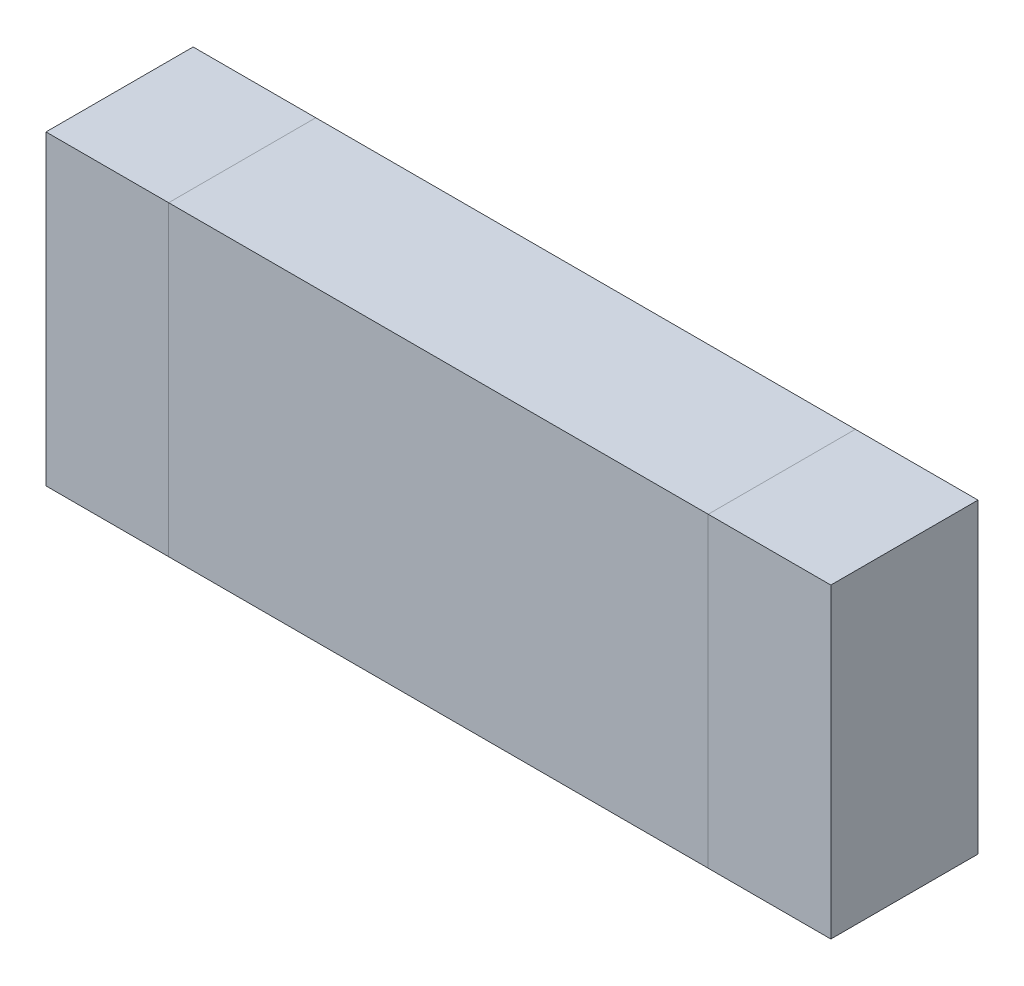
ISO-10303-21;
HEADER;
FILE_DESCRIPTION(('STEP AP214'),'2;1');
FILE_NAME('part.step','',(''),(''),'','','');
FILE_SCHEMA(('AUTOMOTIVE_DESIGN { 1 0 10303 214 1 1 1 1 }'));
ENDSEC;
DATA;
#1=APPLICATION_CONTEXT('core data for automotive mechanical design processes');
#2=APPLICATION_PROTOCOL_DEFINITION('international standard','automotive_design',2000,#1);
#3=PRODUCT_CONTEXT('',#1,'mechanical');
#4=PRODUCT('Part','Part','',(#3));
#5=PRODUCT_RELATED_PRODUCT_CATEGORY('part','',(#4));
#6=PRODUCT_DEFINITION_FORMATION('','',#4);
#7=PRODUCT_DEFINITION_CONTEXT('part definition',#1,'design');
#8=PRODUCT_DEFINITION('design','',#6,#7);
#9=PRODUCT_DEFINITION_SHAPE('','',#8);
#10=(LENGTH_UNIT() NAMED_UNIT(*) SI_UNIT(.MILLI.,.METRE.));
#11=(NAMED_UNIT(*) PLANE_ANGLE_UNIT() SI_UNIT($,.RADIAN.));
#12=(NAMED_UNIT(*) SI_UNIT($,.STERADIAN.) SOLID_ANGLE_UNIT());
#13=UNCERTAINTY_MEASURE_WITH_UNIT(LENGTH_MEASURE(1.E-05),#10,'distance_accuracy_value','');
#14=(GEOMETRIC_REPRESENTATION_CONTEXT(3) GLOBAL_UNCERTAINTY_ASSIGNED_CONTEXT((#13)) GLOBAL_UNIT_ASSIGNED_CONTEXT((#10,
#11,#12)) REPRESENTATION_CONTEXT('',''));
#15=CARTESIAN_POINT('',(0.,0.,0.));
#16=DIRECTION('',(0.,0.,1.));
#17=DIRECTION('',(1.,0.,0.));
#18=AXIS2_PLACEMENT_3D('',#15,#16,#17);
#19=CARTESIAN_POINT('',(-1.6,0.625,0.6));
#20=DIRECTION('',(0.,-1.,0.));
#21=DIRECTION('',(0.,0.,-1.));
#22=AXIS2_PLACEMENT_3D('',#19,#20,#21);
#23=PLANE('',#22);
#24=DIRECTION('',(0.,0.,1.));
#25=VECTOR('',#24,1.);
#26=CARTESIAN_POINT('',(-1.1,0.625,0.6));
#27=LINE('',#26,#25);
#28=CARTESIAN_POINT('',(-1.1,0.625,0.));
#29=VERTEX_POINT('',#28);
#30=CARTESIAN_POINT('',(-1.1,0.625,0.6));
#31=VERTEX_POINT('',#30);
#32=EDGE_CURVE('E11',#29,#31,#27,.T.);
#33=ORIENTED_EDGE('',*,*,#32,.F.);
#34=DIRECTION('',(-1.,0.,0.));
#35=VECTOR('',#34,1.);
#36=CARTESIAN_POINT('',(-1.6,0.625,0.));
#37=LINE('',#36,#35);
#38=CARTESIAN_POINT('',(-1.6,0.625,0.));
#39=VERTEX_POINT('',#38);
#40=EDGE_CURVE('E23',#29,#39,#37,.T.);
#41=ORIENTED_EDGE('',*,*,#40,.T.);
#42=DIRECTION('',(0.,0.,-1.));
#43=VECTOR('',#42,1.);
#44=CARTESIAN_POINT('',(-1.6,0.625,0.6));
#45=LINE('',#44,#43);
#46=CARTESIAN_POINT('',(-1.6,0.625,0.6));
#47=VERTEX_POINT('',#46);
#48=EDGE_CURVE('E150',#47,#39,#45,.T.);
#49=ORIENTED_EDGE('',*,*,#48,.F.);
#50=DIRECTION('',(-1.,0.,0.));
#51=VECTOR('',#50,1.);
#52=CARTESIAN_POINT('',(-1.6,0.625,0.6));
#53=LINE('',#52,#51);
#54=EDGE_CURVE('E147',#31,#47,#53,.T.);
#55=ORIENTED_EDGE('',*,*,#54,.F.);
#56=EDGE_LOOP('',(#33,#41,#49,#55));
#57=FACE_BOUND('',#56,.T.);
#58=ADVANCED_FACE('F16',(#57),#23,.F.);
#59=CARTESIAN_POINT('',(-1.6,0.625,0.6));
#60=DIRECTION('',(0.,-1.,0.));
#61=DIRECTION('',(0.,0.,-1.));
#62=AXIS2_PLACEMENT_3D('',#59,#60,#61);
#63=PLANE('',#62);
#64=DIRECTION('',(0.,0.,-1.));
#65=VECTOR('',#64,1.);
#66=CARTESIAN_POINT('',(1.1,0.625,0.6));
#67=LINE('',#66,#65);
#68=CARTESIAN_POINT('',(1.1,0.625,0.6));
#69=VERTEX_POINT('',#68);
#70=CARTESIAN_POINT('',(1.1,0.625,0.));
#71=VERTEX_POINT('',#70);
#72=EDGE_CURVE('E145',#69,#71,#67,.T.);
#73=ORIENTED_EDGE('',*,*,#72,.F.);
#74=DIRECTION('',(-1.,0.,0.));
#75=VECTOR('',#74,1.);
#76=CARTESIAN_POINT('',(-1.6,0.625,0.6));
#77=LINE('',#76,#75);
#78=CARTESIAN_POINT('',(1.6,0.625,0.6));
#79=VERTEX_POINT('',#78);
#80=EDGE_CURVE('E143',#79,#69,#77,.T.);
#81=ORIENTED_EDGE('',*,*,#80,.F.);
#82=DIRECTION('',(0.,0.,-1.));
#83=VECTOR('',#82,1.);
#84=CARTESIAN_POINT('',(1.6,0.625,0.6));
#85=LINE('',#84,#83);
#86=CARTESIAN_POINT('',(1.6,0.625,0.));
#87=VERTEX_POINT('',#86);
#88=EDGE_CURVE('E102',#79,#87,#85,.T.);
#89=ORIENTED_EDGE('',*,*,#88,.T.);
#90=DIRECTION('',(-1.,0.,0.));
#91=VECTOR('',#90,1.);
#92=CARTESIAN_POINT('',(-1.6,0.625,0.));
#93=LINE('',#92,#91);
#94=EDGE_CURVE('E139',#87,#71,#93,.T.);
#95=ORIENTED_EDGE('',*,*,#94,.T.);
#96=EDGE_LOOP('',(#73,#81,#89,#95));
#97=FACE_BOUND('',#96,.T.);
#98=ADVANCED_FACE('F182',(#97),#63,.F.);
#99=CARTESIAN_POINT('',(0.,0.,0.));
#100=DIRECTION('',(0.,0.,-1.));
#101=DIRECTION('',(-1.,0.,0.));
#102=AXIS2_PLACEMENT_3D('',#99,#100,#101);
#103=PLANE('',#102);
#104=ORIENTED_EDGE('',*,*,#40,.F.);
#105=DIRECTION('',(0.,-1.,0.));
#106=VECTOR('',#105,1.);
#107=CARTESIAN_POINT('',(-1.1,0.,0.));
#108=LINE('',#107,#106);
#109=CARTESIAN_POINT('',(-1.1,-0.625,0.));
#110=VERTEX_POINT('',#109);
#111=EDGE_CURVE('E137',#29,#110,#108,.T.);
#112=ORIENTED_EDGE('',*,*,#111,.T.);
#113=DIRECTION('',(1.,0.,0.));
#114=VECTOR('',#113,1.);
#115=CARTESIAN_POINT('',(1.6,-0.625,0.));
#116=LINE('',#115,#114);
#117=CARTESIAN_POINT('',(-1.6,-0.625,0.));
#118=VERTEX_POINT('',#117);
#119=EDGE_CURVE('E134',#118,#110,#116,.T.);
#120=ORIENTED_EDGE('',*,*,#119,.F.);
#121=DIRECTION('',(0.,-1.,0.));
#122=VECTOR('',#121,1.);
#123=CARTESIAN_POINT('',(-1.6,-0.625,0.));
#124=LINE('',#123,#122);
#125=EDGE_CURVE('E131',#39,#118,#124,.T.);
#126=ORIENTED_EDGE('',*,*,#125,.F.);
#127=EDGE_LOOP('',(#104,#112,#120,#126));
#128=FACE_BOUND('',#127,.T.);
#129=ADVANCED_FACE('F159',(#128),#103,.T.);
#130=CARTESIAN_POINT('',(0.,0.,0.));
#131=DIRECTION('',(0.,0.,-1.));
#132=DIRECTION('',(-1.,0.,0.));
#133=AXIS2_PLACEMENT_3D('',#130,#131,#132);
#134=PLANE('',#133);
#135=DIRECTION('',(1.,0.,0.));
#136=VECTOR('',#135,1.);
#137=CARTESIAN_POINT('',(1.6,-0.625,0.));
#138=LINE('',#137,#136);
#139=CARTESIAN_POINT('',(1.1,-0.625,0.));
#140=VERTEX_POINT('',#139);
#141=CARTESIAN_POINT('',(1.6,-0.625,0.));
#142=VERTEX_POINT('',#141);
#143=EDGE_CURVE('E83',#140,#142,#138,.T.);
#144=ORIENTED_EDGE('',*,*,#143,.F.);
#145=DIRECTION('',(0.,1.,0.));
#146=VECTOR('',#145,1.);
#147=CARTESIAN_POINT('',(1.1,0.,0.));
#148=LINE('',#147,#146);
#149=EDGE_CURVE('E127',#140,#71,#148,.T.);
#150=ORIENTED_EDGE('',*,*,#149,.T.);
#151=ORIENTED_EDGE('',*,*,#94,.F.);
#152=DIRECTION('',(0.,1.,0.));
#153=VECTOR('',#152,1.);
#154=CARTESIAN_POINT('',(1.6,0.625,0.));
#155=LINE('',#154,#153);
#156=EDGE_CURVE('E125',#142,#87,#155,.T.);
#157=ORIENTED_EDGE('',*,*,#156,.F.);
#158=EDGE_LOOP('',(#144,#150,#151,#157));
#159=FACE_BOUND('',#158,.T.);
#160=ADVANCED_FACE('F184',(#159),#134,.T.);
#161=CARTESIAN_POINT('',(1.6,-0.625,0.6));
#162=DIRECTION('',(0.,1.,0.));
#163=DIRECTION('',(0.,0.,1.));
#164=AXIS2_PLACEMENT_3D('',#161,#162,#163);
#165=PLANE('',#164);
#166=DIRECTION('',(0.,0.,-1.));
#167=VECTOR('',#166,1.);
#168=CARTESIAN_POINT('',(-1.1,-0.625,0.6));
#169=LINE('',#168,#167);
#170=CARTESIAN_POINT('',(-1.1,-0.625,0.6));
#171=VERTEX_POINT('',#170);
#172=EDGE_CURVE('E122',#171,#110,#169,.T.);
#173=ORIENTED_EDGE('',*,*,#172,.F.);
#174=DIRECTION('',(1.,0.,0.));
#175=VECTOR('',#174,1.);
#176=CARTESIAN_POINT('',(1.6,-0.625,0.6));
#177=LINE('',#176,#175);
#178=CARTESIAN_POINT('',(-1.6,-0.625,0.6));
#179=VERTEX_POINT('',#178);
#180=EDGE_CURVE('E119',#179,#171,#177,.T.);
#181=ORIENTED_EDGE('',*,*,#180,.F.);
#182=DIRECTION('',(0.,0.,-1.));
#183=VECTOR('',#182,1.);
#184=CARTESIAN_POINT('',(-1.6,-0.625,0.6));
#185=LINE('',#184,#183);
#186=EDGE_CURVE('E116',#179,#118,#185,.T.);
#187=ORIENTED_EDGE('',*,*,#186,.T.);
#188=ORIENTED_EDGE('',*,*,#119,.T.);
#189=EDGE_LOOP('',(#173,#181,#187,#188));
#190=FACE_BOUND('',#189,.T.);
#191=ADVANCED_FACE('F161',(#190),#165,.F.);
#192=CARTESIAN_POINT('',(1.6,-0.625,0.6));
#193=DIRECTION('',(0.,1.,0.));
#194=DIRECTION('',(0.,0.,1.));
#195=AXIS2_PLACEMENT_3D('',#192,#193,#194);
#196=PLANE('',#195);
#197=DIRECTION('',(0.,0.,1.));
#198=VECTOR('',#197,1.);
#199=CARTESIAN_POINT('',(1.1,-0.625,0.6));
#200=LINE('',#199,#198);
#201=CARTESIAN_POINT('',(1.1,-0.625,0.6));
#202=VERTEX_POINT('',#201);
#203=EDGE_CURVE('E88',#140,#202,#200,.T.);
#204=ORIENTED_EDGE('',*,*,#203,.F.);
#205=ORIENTED_EDGE('',*,*,#143,.T.);
#206=DIRECTION('',(0.,0.,-1.));
#207=VECTOR('',#206,1.);
#208=CARTESIAN_POINT('',(1.6,-0.625,0.6));
#209=LINE('',#208,#207);
#210=CARTESIAN_POINT('',(1.6,-0.625,0.6));
#211=VERTEX_POINT('',#210);
#212=EDGE_CURVE('E77',#211,#142,#209,.T.);
#213=ORIENTED_EDGE('',*,*,#212,.F.);
#214=DIRECTION('',(1.,0.,0.));
#215=VECTOR('',#214,1.);
#216=CARTESIAN_POINT('',(1.6,-0.625,0.6));
#217=LINE('',#216,#215);
#218=EDGE_CURVE('E81',#202,#211,#217,.T.);
#219=ORIENTED_EDGE('',*,*,#218,.F.);
#220=EDGE_LOOP('',(#204,#205,#213,#219));
#221=FACE_BOUND('',#220,.T.);
#222=ADVANCED_FACE('F80',(#221),#196,.F.);
#223=CARTESIAN_POINT('',(0.,0.,0.6));
#224=DIRECTION('',(0.,0.,-1.));
#225=DIRECTION('',(-1.,0.,0.));
#226=AXIS2_PLACEMENT_3D('',#223,#224,#225);
#227=PLANE('',#226);
#228=DIRECTION('',(0.,-1.,0.));
#229=VECTOR('',#228,1.);
#230=CARTESIAN_POINT('',(-1.1,0.,0.6));
#231=LINE('',#230,#229);
#232=EDGE_CURVE('E98',#31,#171,#231,.T.);
#233=ORIENTED_EDGE('',*,*,#232,.F.);
#234=ORIENTED_EDGE('',*,*,#54,.T.);
#235=DIRECTION('',(0.,-1.,0.));
#236=VECTOR('',#235,1.);
#237=CARTESIAN_POINT('',(-1.6,-0.625,0.6));
#238=LINE('',#237,#236);
#239=EDGE_CURVE('E105',#47,#179,#238,.T.);
#240=ORIENTED_EDGE('',*,*,#239,.T.);
#241=ORIENTED_EDGE('',*,*,#180,.T.);
#242=EDGE_LOOP('',(#233,#234,#240,#241));
#243=FACE_BOUND('',#242,.T.);
#244=ADVANCED_FACE('F228',(#243),#227,.F.);
#245=CARTESIAN_POINT('',(0.,0.,0.6));
#246=DIRECTION('',(0.,0.,-1.));
#247=DIRECTION('',(-1.,0.,0.));
#248=AXIS2_PLACEMENT_3D('',#245,#246,#247);
#249=PLANE('',#248);
#250=DIRECTION('',(0.,1.,0.));
#251=VECTOR('',#250,1.);
#252=CARTESIAN_POINT('',(1.1,0.,0.6));
#253=LINE('',#252,#251);
#254=EDGE_CURVE('E96',#202,#69,#253,.T.);
#255=ORIENTED_EDGE('',*,*,#254,.F.);
#256=ORIENTED_EDGE('',*,*,#218,.T.);
#257=DIRECTION('',(0.,1.,0.));
#258=VECTOR('',#257,1.);
#259=CARTESIAN_POINT('',(1.6,0.625,0.6));
#260=LINE('',#259,#258);
#261=EDGE_CURVE('E94',#211,#79,#260,.T.);
#262=ORIENTED_EDGE('',*,*,#261,.T.);
#263=ORIENTED_EDGE('',*,*,#80,.T.);
#264=EDGE_LOOP('',(#255,#256,#262,#263));
#265=FACE_BOUND('',#264,.T.);
#266=ADVANCED_FACE('F92',(#265),#249,.F.);
#267=CARTESIAN_POINT('',(1.6,0.625,0.6));
#268=DIRECTION('',(-1.,0.,0.));
#269=DIRECTION('',(0.,0.,1.));
#270=AXIS2_PLACEMENT_3D('',#267,#268,#269);
#271=PLANE('',#270);
#272=ORIENTED_EDGE('',*,*,#156,.T.);
#273=ORIENTED_EDGE('',*,*,#88,.F.);
#274=ORIENTED_EDGE('',*,*,#261,.F.);
#275=ORIENTED_EDGE('',*,*,#212,.T.);
#276=EDGE_LOOP('',(#272,#273,#274,#275));
#277=FACE_BOUND('',#276,.T.);
#278=ADVANCED_FACE('F101',(#277),#271,.F.);
#279=CARTESIAN_POINT('',(-1.6,0.625,0.6));
#280=DIRECTION('',(0.,-1.,0.));
#281=DIRECTION('',(0.,0.,-1.));
#282=AXIS2_PLACEMENT_3D('',#279,#280,#281);
#283=PLANE('',#282);
#284=DIRECTION('',(-1.,0.,0.));
#285=VECTOR('',#284,1.);
#286=CARTESIAN_POINT('',(-1.6,0.625,0.));
#287=LINE('',#286,#285);
#288=EDGE_CURVE('E103',#71,#29,#287,.T.);
#289=ORIENTED_EDGE('',*,*,#288,.T.);
#290=ORIENTED_EDGE('',*,*,#32,.T.);
#291=DIRECTION('',(-1.,0.,0.));
#292=VECTOR('',#291,1.);
#293=CARTESIAN_POINT('',(-1.6,0.625,0.6));
#294=LINE('',#293,#292);
#295=EDGE_CURVE('E107',#69,#31,#294,.T.);
#296=ORIENTED_EDGE('',*,*,#295,.F.);
#297=ORIENTED_EDGE('',*,*,#72,.T.);
#298=EDGE_LOOP('',(#289,#290,#296,#297));
#299=FACE_BOUND('',#298,.T.);
#300=ADVANCED_FACE('F179',(#299),#283,.F.);
#301=CARTESIAN_POINT('',(-1.6,-0.625,0.6));
#302=DIRECTION('',(1.,0.,0.));
#303=DIRECTION('',(0.,0.,-1.));
#304=AXIS2_PLACEMENT_3D('',#301,#302,#303);
#305=PLANE('',#304);
#306=ORIENTED_EDGE('',*,*,#125,.T.);
#307=ORIENTED_EDGE('',*,*,#186,.F.);
#308=ORIENTED_EDGE('',*,*,#239,.F.);
#309=ORIENTED_EDGE('',*,*,#48,.T.);
#310=EDGE_LOOP('',(#306,#307,#308,#309));
#311=FACE_BOUND('',#310,.T.);
#312=ADVANCED_FACE('F157',(#311),#305,.F.);
#313=CARTESIAN_POINT('',(1.6,-0.625,0.6));
#314=DIRECTION('',(0.,1.,0.));
#315=DIRECTION('',(0.,0.,1.));
#316=AXIS2_PLACEMENT_3D('',#313,#314,#315);
#317=PLANE('',#316);
#318=DIRECTION('',(1.,0.,0.));
#319=VECTOR('',#318,1.);
#320=CARTESIAN_POINT('',(1.6,-0.625,0.6));
#321=LINE('',#320,#319);
#322=EDGE_CURVE('E168',#171,#202,#321,.T.);
#323=ORIENTED_EDGE('',*,*,#322,.F.);
#324=ORIENTED_EDGE('',*,*,#172,.T.);
#325=DIRECTION('',(1.,0.,0.));
#326=VECTOR('',#325,1.);
#327=CARTESIAN_POINT('',(1.6,-0.625,0.));
#328=LINE('',#327,#326);
#329=EDGE_CURVE('E167',#110,#140,#328,.T.);
#330=ORIENTED_EDGE('',*,*,#329,.T.);
#331=ORIENTED_EDGE('',*,*,#203,.T.);
#332=EDGE_LOOP('',(#323,#324,#330,#331));
#333=FACE_BOUND('',#332,.T.);
#334=ADVANCED_FACE('F166',(#333),#317,.F.);
#335=CARTESIAN_POINT('',(0.,0.,0.6));
#336=DIRECTION('',(0.,0.,-1.));
#337=DIRECTION('',(-1.,0.,0.));
#338=AXIS2_PLACEMENT_3D('',#335,#336,#337);
#339=PLANE('',#338);
#340=ORIENTED_EDGE('',*,*,#295,.T.);
#341=ORIENTED_EDGE('',*,*,#232,.T.);
#342=ORIENTED_EDGE('',*,*,#322,.T.);
#343=ORIENTED_EDGE('',*,*,#254,.T.);
#344=EDGE_LOOP('',(#340,#341,#342,#343));
#345=FACE_BOUND('',#344,.T.);
#346=ADVANCED_FACE('F177',(#345),#339,.F.);
#347=CARTESIAN_POINT('',(0.,0.,0.));
#348=DIRECTION('',(0.,0.,-1.));
#349=DIRECTION('',(-1.,0.,0.));
#350=AXIS2_PLACEMENT_3D('',#347,#348,#349);
#351=PLANE('',#350);
#352=ORIENTED_EDGE('',*,*,#111,.F.);
#353=ORIENTED_EDGE('',*,*,#288,.F.);
#354=ORIENTED_EDGE('',*,*,#149,.F.);
#355=ORIENTED_EDGE('',*,*,#329,.F.);
#356=EDGE_LOOP('',(#352,#353,#354,#355));
#357=FACE_BOUND('',#356,.T.);
#358=ADVANCED_FACE('F171',(#357),#351,.T.);
#359=CLOSED_SHELL('',(#58,#98,#129,#160,#191,#222,#244,#266,#278,#300,#312,#334,#346,#358));
#360=MANIFOLD_SOLID_BREP('B1',#359);
#361=ADVANCED_BREP_SHAPE_REPRESENTATION('',(#18,#360),#14);
#362=SHAPE_DEFINITION_REPRESENTATION(#9,#361);
ENDSEC;
END-ISO-10303-21;
